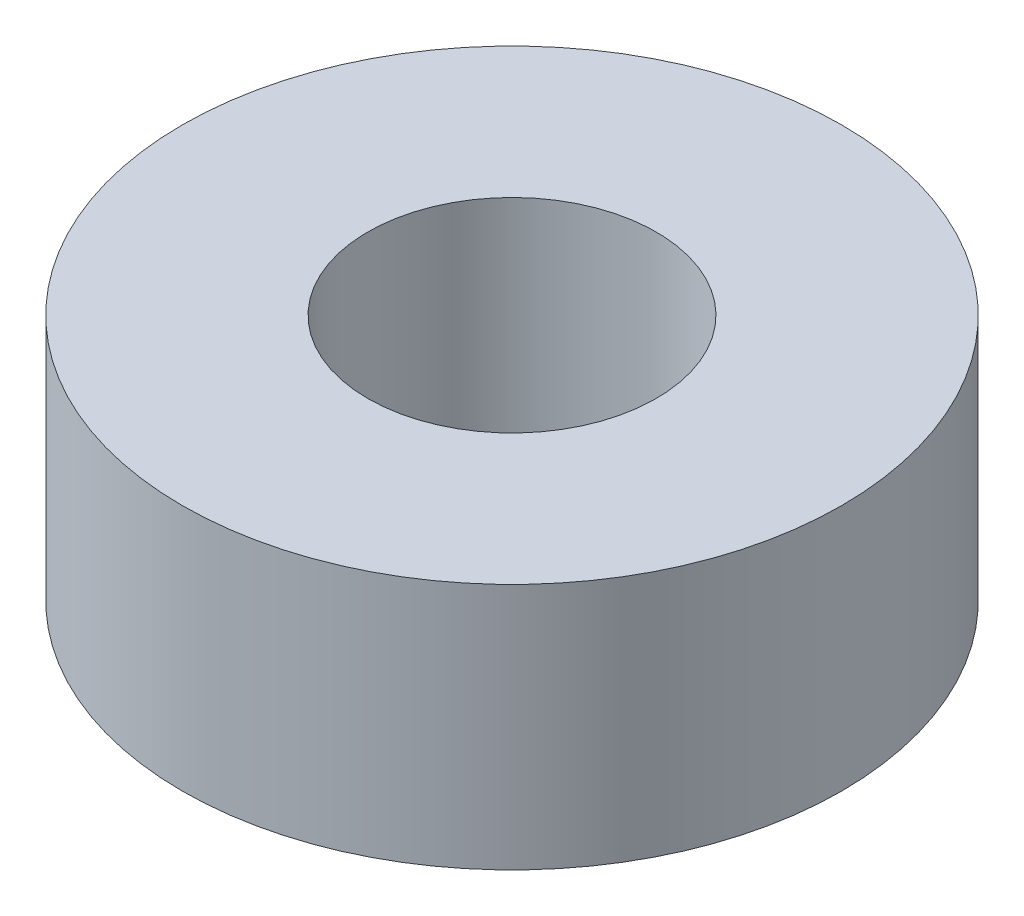
ISO-10303-21;
HEADER;
FILE_DESCRIPTION(('STEP AP214'),'2;1');
FILE_NAME('part.step','',(''),(''),'','','');
FILE_SCHEMA(('AUTOMOTIVE_DESIGN { 1 0 10303 214 1 1 1 1 }'));
ENDSEC;
DATA;
#1=APPLICATION_CONTEXT('core data for automotive mechanical design processes');
#2=APPLICATION_PROTOCOL_DEFINITION('international standard','automotive_design',2000,#1);
#3=PRODUCT_CONTEXT('',#1,'mechanical');
#4=PRODUCT('Part','Part','',(#3));
#5=PRODUCT_RELATED_PRODUCT_CATEGORY('part','',(#4));
#6=PRODUCT_DEFINITION_FORMATION('','',#4);
#7=PRODUCT_DEFINITION_CONTEXT('part definition',#1,'design');
#8=PRODUCT_DEFINITION('design','',#6,#7);
#9=PRODUCT_DEFINITION_SHAPE('','',#8);
#10=(LENGTH_UNIT() NAMED_UNIT(*) SI_UNIT(.MILLI.,.METRE.));
#11=(NAMED_UNIT(*) PLANE_ANGLE_UNIT() SI_UNIT($,.RADIAN.));
#12=(NAMED_UNIT(*) SI_UNIT($,.STERADIAN.) SOLID_ANGLE_UNIT());
#13=UNCERTAINTY_MEASURE_WITH_UNIT(LENGTH_MEASURE(1.E-05),#10,'distance_accuracy_value','');
#14=(GEOMETRIC_REPRESENTATION_CONTEXT(3) GLOBAL_UNCERTAINTY_ASSIGNED_CONTEXT((#13)) GLOBAL_UNIT_ASSIGNED_CONTEXT((#10,
#11,#12)) REPRESENTATION_CONTEXT('',''));
#15=CARTESIAN_POINT('',(0.,0.,0.));
#16=DIRECTION('',(0.,0.,1.));
#17=DIRECTION('',(1.,0.,0.));
#18=AXIS2_PLACEMENT_3D('',#15,#16,#17);
#19=CARTESIAN_POINT('',(0.,3.,0.));
#20=DIRECTION('',(0.,1.,0.));
#21=DIRECTION('',(0.,0.,1.));
#22=AXIS2_PLACEMENT_3D('',#19,#20,#21);
#23=PLANE('',#22);
#24=CARTESIAN_POINT('',(0.,3.,0.));
#25=DIRECTION('',(0.,1.,0.));
#26=DIRECTION('',(0.,0.,1.));
#27=AXIS2_PLACEMENT_3D('',#24,#25,#26);
#28=CIRCLE('',#27,4.);
#29=CARTESIAN_POINT('',(0.,3.,4.));
#30=VERTEX_POINT('',#29);
#31=EDGE_CURVE('E10',#30,#30,#28,.T.);
#32=ORIENTED_EDGE('',*,*,#31,.T.);
#33=EDGE_LOOP('',(#32));
#34=FACE_BOUND('',#33,.T.);
#35=CARTESIAN_POINT('',(0.,3.,0.));
#36=DIRECTION('',(0.,1.,0.));
#37=DIRECTION('',(0.,0.,1.));
#38=AXIS2_PLACEMENT_3D('',#35,#36,#37);
#39=CIRCLE('',#38,1.75);
#40=CARTESIAN_POINT('',(0.,3.,1.75));
#41=VERTEX_POINT('',#40);
#42=EDGE_CURVE('E43',#41,#41,#39,.T.);
#43=ORIENTED_EDGE('',*,*,#42,.F.);
#44=EDGE_LOOP('',(#43));
#45=FACE_BOUND('',#44,.T.);
#46=ADVANCED_FACE('F32',(#34,#45),#23,.T.);
#47=CARTESIAN_POINT('',(0.,0.,0.));
#48=DIRECTION('',(0.,1.,0.));
#49=DIRECTION('',(0.,0.,1.));
#50=AXIS2_PLACEMENT_3D('',#47,#48,#49);
#51=PLANE('',#50);
#52=CARTESIAN_POINT('',(0.,0.,0.));
#53=DIRECTION('',(0.,1.,0.));
#54=DIRECTION('',(0.,0.,1.));
#55=AXIS2_PLACEMENT_3D('',#52,#53,#54);
#56=CIRCLE('',#55,4.);
#57=CARTESIAN_POINT('',(0.,0.,4.));
#58=VERTEX_POINT('',#57);
#59=EDGE_CURVE('E36',#58,#58,#56,.T.);
#60=ORIENTED_EDGE('',*,*,#59,.F.);
#61=EDGE_LOOP('',(#60));
#62=FACE_BOUND('',#61,.T.);
#63=CARTESIAN_POINT('',(0.,0.,0.));
#64=DIRECTION('',(0.,1.,0.));
#65=DIRECTION('',(0.,0.,1.));
#66=AXIS2_PLACEMENT_3D('',#63,#64,#65);
#67=CIRCLE('',#66,1.75);
#68=CARTESIAN_POINT('',(0.,0.,1.75));
#69=VERTEX_POINT('',#68);
#70=EDGE_CURVE('E45',#69,#69,#67,.T.);
#71=ORIENTED_EDGE('',*,*,#70,.T.);
#72=EDGE_LOOP('',(#71));
#73=FACE_BOUND('',#72,.T.);
#74=ADVANCED_FACE('F55',(#62,#73),#51,.F.);
#75=CARTESIAN_POINT('',(0.,3.,0.));
#76=DIRECTION('',(0.,-1.,0.));
#77=DIRECTION('',(0.,0.,-1.));
#78=AXIS2_PLACEMENT_3D('',#75,#76,#77);
#79=CYLINDRICAL_SURFACE('',#78,4.);
#80=ORIENTED_EDGE('',*,*,#31,.F.);
#81=EDGE_LOOP('',(#80));
#82=FACE_BOUND('',#81,.T.);
#83=ORIENTED_EDGE('',*,*,#59,.T.);
#84=EDGE_LOOP('',(#83));
#85=FACE_BOUND('',#84,.T.);
#86=ADVANCED_FACE('F34',(#82,#85),#79,.T.);
#87=CARTESIAN_POINT('',(0.,3.,0.));
#88=DIRECTION('',(0.,-1.,0.));
#89=DIRECTION('',(0.,0.,-1.));
#90=AXIS2_PLACEMENT_3D('',#87,#88,#89);
#91=CYLINDRICAL_SURFACE('',#90,1.75);
#92=ORIENTED_EDGE('',*,*,#42,.T.);
#93=EDGE_LOOP('',(#92));
#94=FACE_BOUND('',#93,.T.);
#95=ORIENTED_EDGE('',*,*,#70,.F.);
#96=EDGE_LOOP('',(#95));
#97=FACE_BOUND('',#96,.T.);
#98=ADVANCED_FACE('F51',(#94,#97),#91,.F.);
#99=CLOSED_SHELL('',(#46,#74,#86,#98));
#100=MANIFOLD_SOLID_BREP('B2',#99);
#101=ADVANCED_BREP_SHAPE_REPRESENTATION('',(#18,#100),#14);
#102=SHAPE_DEFINITION_REPRESENTATION(#9,#101);
ENDSEC;
END-ISO-10303-21;
